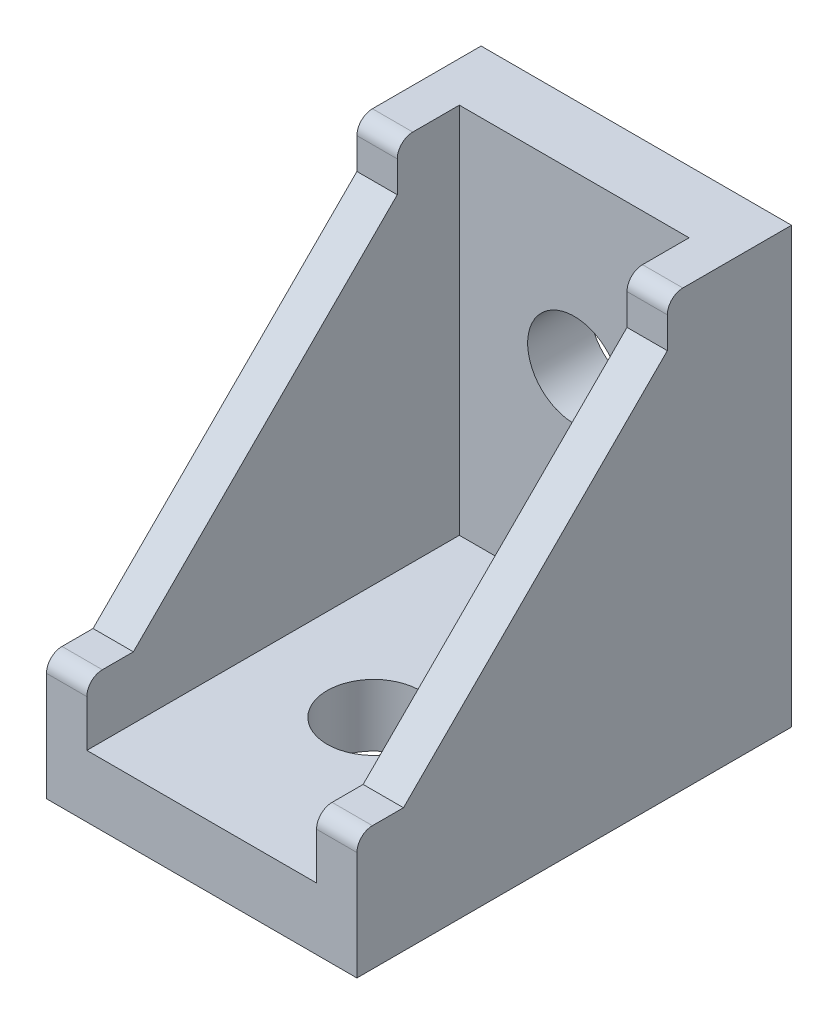
ISO-10303-21;
HEADER;
FILE_DESCRIPTION(('STEP AP214'),'2;1');
FILE_NAME('part.step','',(''),(''),'','','');
FILE_SCHEMA(('AUTOMOTIVE_DESIGN { 1 0 10303 214 1 1 1 1 }'));
ENDSEC;
DATA;
#1=APPLICATION_CONTEXT('core data for automotive mechanical design processes');
#2=APPLICATION_PROTOCOL_DEFINITION('international standard','automotive_design',2000,#1);
#3=PRODUCT_CONTEXT('',#1,'mechanical');
#4=PRODUCT('Part','Part','',(#3));
#5=PRODUCT_RELATED_PRODUCT_CATEGORY('part','',(#4));
#6=PRODUCT_DEFINITION_FORMATION('','',#4);
#7=PRODUCT_DEFINITION_CONTEXT('part definition',#1,'design');
#8=PRODUCT_DEFINITION('design','',#6,#7);
#9=PRODUCT_DEFINITION_SHAPE('','',#8);
#10=(LENGTH_UNIT() NAMED_UNIT(*) SI_UNIT(.MILLI.,.METRE.));
#11=(NAMED_UNIT(*) PLANE_ANGLE_UNIT() SI_UNIT($,.RADIAN.));
#12=(NAMED_UNIT(*) SI_UNIT($,.STERADIAN.) SOLID_ANGLE_UNIT());
#13=UNCERTAINTY_MEASURE_WITH_UNIT(LENGTH_MEASURE(1.E-05),#10,'distance_accuracy_value','');
#14=(GEOMETRIC_REPRESENTATION_CONTEXT(3) GLOBAL_UNCERTAINTY_ASSIGNED_CONTEXT((#13)) GLOBAL_UNIT_ASSIGNED_CONTEXT((#10,
#11,#12)) REPRESENTATION_CONTEXT('',''));
#15=CARTESIAN_POINT('',(0.,0.,0.));
#16=DIRECTION('',(0.,0.,1.));
#17=DIRECTION('',(1.,0.,0.));
#18=AXIS2_PLACEMENT_3D('',#15,#16,#17);
#19=CARTESIAN_POINT('',(-10.,-9.99999999999998,28.));
#20=DIRECTION('',(0.,-1.,0.));
#21=DIRECTION('',(0.,0.,-1.));
#22=AXIS2_PLACEMENT_3D('',#19,#20,#21);
#23=PLANE('',#22);
#24=DIRECTION('',(0.,0.,1.));
#25=VECTOR('',#24,1.);
#26=CARTESIAN_POINT('',(7.40000000000001,-9.99999999999998,4.));
#27=LINE('',#26,#25);
#28=CARTESIAN_POINT('',(7.40000000000001,-9.99999999999998,4.));
#29=VERTEX_POINT('',#28);
#30=CARTESIAN_POINT('',(7.40000000000001,-9.99999999999998,28.));
#31=VERTEX_POINT('',#30);
#32=EDGE_CURVE('E344',#29,#31,#27,.T.);
#33=ORIENTED_EDGE('',*,*,#32,.F.);
#34=DIRECTION('',(-1.,0.,0.));
#35=VECTOR('',#34,1.);
#36=CARTESIAN_POINT('',(-10.,-9.99999999999998,4.));
#37=LINE('',#36,#35);
#38=CARTESIAN_POINT('',(-7.40000000000001,-9.99999999999998,4.));
#39=VERTEX_POINT('',#38);
#40=EDGE_CURVE('E174',#29,#39,#37,.T.);
#41=ORIENTED_EDGE('',*,*,#40,.T.);
#42=DIRECTION('',(0.,0.,1.));
#43=VECTOR('',#42,1.);
#44=CARTESIAN_POINT('',(-7.40000000000001,-9.99999999999998,4.));
#45=LINE('',#44,#43);
#46=CARTESIAN_POINT('',(-7.40000000000001,-9.99999999999998,28.));
#47=VERTEX_POINT('',#46);
#48=EDGE_CURVE('E305',#39,#47,#45,.T.);
#49=ORIENTED_EDGE('',*,*,#48,.T.);
#50=DIRECTION('',(-1.,0.,0.));
#51=VECTOR('',#50,1.);
#52=CARTESIAN_POINT('',(-10.,-9.99999999999998,28.));
#53=LINE('',#52,#51);
#54=EDGE_CURVE('E196',#31,#47,#53,.T.);
#55=ORIENTED_EDGE('',*,*,#54,.F.);
#56=EDGE_LOOP('',(#33,#41,#49,#55));
#57=FACE_BOUND('',#56,.T.);
#58=CARTESIAN_POINT('',(0.,-9.99999999999999,16.9205349575155));
#59=DIRECTION('',(0.,-1.,0.));
#60=DIRECTION('',(1.,0.,0.));
#61=AXIS2_PLACEMENT_3D('',#58,#59,#60);
#62=CIRCLE('',#61,3.);
#63=CARTESIAN_POINT('',(3.,-9.99999999999999,16.9205349575155));
#64=VERTEX_POINT('',#63);
#65=EDGE_CURVE('E513',#64,#64,#62,.T.);
#66=ORIENTED_EDGE('',*,*,#65,.T.);
#67=EDGE_LOOP('',(#66));
#68=FACE_BOUND('',#67,.T.);
#69=ADVANCED_FACE('F31',(#57,#68),#23,.F.);
#70=CARTESIAN_POINT('',(-10.,-14.,4.));
#71=DIRECTION('',(0.,1.,0.));
#72=DIRECTION('',(0.,0.,1.));
#73=AXIS2_PLACEMENT_3D('',#70,#71,#72);
#74=PLANE('',#73);
#75=DIRECTION('',(1.,0.,0.));
#76=VECTOR('',#75,1.);
#77=CARTESIAN_POINT('',(-10.,-14.,0.));
#78=LINE('',#77,#76);
#79=CARTESIAN_POINT('',(-10.,-14.,0.));
#80=VERTEX_POINT('',#79);
#81=CARTESIAN_POINT('',(9.99999999999999,-14.,0.));
#82=VERTEX_POINT('',#81);
#83=EDGE_CURVE('E181',#80,#82,#78,.T.);
#84=ORIENTED_EDGE('',*,*,#83,.T.);
#85=DIRECTION('',(0.,0.,-1.));
#86=VECTOR('',#85,1.);
#87=CARTESIAN_POINT('',(9.99999999999999,-14.,4.));
#88=LINE('',#87,#86);
#89=CARTESIAN_POINT('',(9.99999999999999,-14.,28.));
#90=VERTEX_POINT('',#89);
#91=EDGE_CURVE('E180',#90,#82,#88,.T.);
#92=ORIENTED_EDGE('',*,*,#91,.F.);
#93=DIRECTION('',(1.,0.,0.));
#94=VECTOR('',#93,1.);
#95=CARTESIAN_POINT('',(-10.,-14.,28.));
#96=LINE('',#95,#94);
#97=CARTESIAN_POINT('',(-10.,-14.,28.));
#98=VERTEX_POINT('',#97);
#99=EDGE_CURVE('E289',#98,#90,#96,.T.);
#100=ORIENTED_EDGE('',*,*,#99,.F.);
#101=DIRECTION('',(0.,0.,-1.));
#102=VECTOR('',#101,1.);
#103=CARTESIAN_POINT('',(-10.,-14.,4.));
#104=LINE('',#103,#102);
#105=EDGE_CURVE('E184',#98,#80,#104,.T.);
#106=ORIENTED_EDGE('',*,*,#105,.T.);
#107=EDGE_LOOP('',(#84,#92,#100,#106));
#108=FACE_BOUND('',#107,.T.);
#109=CARTESIAN_POINT('',(0.,-14.,16.9205349575155));
#110=DIRECTION('',(0.,-1.,0.));
#111=DIRECTION('',(1.,0.,0.));
#112=AXIS2_PLACEMENT_3D('',#109,#110,#111);
#113=CIRCLE('',#112,3.);
#114=CARTESIAN_POINT('',(3.,-14.,16.9205349575155));
#115=VERTEX_POINT('',#114);
#116=EDGE_CURVE('E510',#115,#115,#113,.T.);
#117=ORIENTED_EDGE('',*,*,#116,.F.);
#118=EDGE_LOOP('',(#117));
#119=FACE_BOUND('',#118,.T.);
#120=ADVANCED_FACE('F327',(#108,#119),#74,.F.);
#121=CARTESIAN_POINT('',(9.99999999999999,-14.,4.));
#122=DIRECTION('',(0.,0.,1.));
#123=DIRECTION('',(1.,0.,0.));
#124=AXIS2_PLACEMENT_3D('',#121,#122,#123);
#125=PLANE('',#124);
#126=CARTESIAN_POINT('',(0.,2.92053495751556,4.));
#127=DIRECTION('',(0.,0.,1.));
#128=DIRECTION('',(1.,0.,0.));
#129=AXIS2_PLACEMENT_3D('',#126,#127,#128);
#130=CIRCLE('',#129,3.);
#131=CARTESIAN_POINT('',(3.,2.92053495751556,4.));
#132=VERTEX_POINT('',#131);
#133=EDGE_CURVE('E515',#132,#132,#130,.T.);
#134=ORIENTED_EDGE('',*,*,#133,.F.);
#135=EDGE_LOOP('',(#134));
#136=FACE_BOUND('',#135,.T.);
#137=ORIENTED_EDGE('',*,*,#40,.F.);
#138=DIRECTION('',(0.,-1.,0.));
#139=VECTOR('',#138,1.);
#140=CARTESIAN_POINT('',(7.40000000000001,14.,4.));
#141=LINE('',#140,#139);
#142=CARTESIAN_POINT('',(7.40000000000001,14.,4.));
#143=VERTEX_POINT('',#142);
#144=EDGE_CURVE('E159',#143,#29,#141,.T.);
#145=ORIENTED_EDGE('',*,*,#144,.F.);
#146=DIRECTION('',(-1.,0.,0.));
#147=VECTOR('',#146,1.);
#148=CARTESIAN_POINT('',(-10.,14.,4.));
#149=LINE('',#148,#147);
#150=CARTESIAN_POINT('',(-7.40000000000001,14.,4.));
#151=VERTEX_POINT('',#150);
#152=EDGE_CURVE('E172',#143,#151,#149,.T.);
#153=ORIENTED_EDGE('',*,*,#152,.T.);
#154=DIRECTION('',(0.,-1.,0.));
#155=VECTOR('',#154,1.);
#156=CARTESIAN_POINT('',(-7.40000000000001,14.,4.));
#157=LINE('',#156,#155);
#158=EDGE_CURVE('E284',#151,#39,#157,.T.);
#159=ORIENTED_EDGE('',*,*,#158,.T.);
#160=EDGE_LOOP('',(#137,#145,#153,#159));
#161=FACE_BOUND('',#160,.T.);
#162=ADVANCED_FACE('F170',(#136,#161),#125,.T.);
#163=CARTESIAN_POINT('',(9.99999999999999,14.,4.));
#164=DIRECTION('',(-1.,0.,0.));
#165=DIRECTION('',(0.,-1.,0.));
#166=AXIS2_PLACEMENT_3D('',#163,#164,#165);
#167=PLANE('',#166);
#168=DIRECTION('',(0.,0.,-1.));
#169=VECTOR('',#168,1.);
#170=CARTESIAN_POINT('',(10.,-5.99999999999998,25.));
#171=LINE('',#170,#169);
#172=CARTESIAN_POINT('',(10.,-5.99999999999998,27.));
#173=VERTEX_POINT('',#172);
#174=CARTESIAN_POINT('',(10.,-5.99999999999998,25.));
#175=VERTEX_POINT('',#174);
#176=EDGE_CURVE('E175',#173,#175,#171,.T.);
#177=ORIENTED_EDGE('',*,*,#176,.F.);
#178=CARTESIAN_POINT('',(9.99999999999999,-6.99999999999998,27.));
#179=DIRECTION('',(-1.,0.,0.));
#180=DIRECTION('',(0.,-1.,0.));
#181=AXIS2_PLACEMENT_3D('',#178,#179,#180);
#182=CIRCLE('',#181,1.);
#183=CARTESIAN_POINT('',(9.99999999999999,-6.99999999999998,28.));
#184=VERTEX_POINT('',#183);
#185=EDGE_CURVE('E229',#173,#184,#182,.F.);
#186=ORIENTED_EDGE('',*,*,#185,.T.);
#187=DIRECTION('',(0.,1.,0.));
#188=VECTOR('',#187,1.);
#189=CARTESIAN_POINT('',(9.99999999999999,-14.,28.));
#190=LINE('',#189,#188);
#191=EDGE_CURVE('E292',#90,#184,#190,.T.);
#192=ORIENTED_EDGE('',*,*,#191,.F.);
#193=ORIENTED_EDGE('',*,*,#91,.T.);
#194=DIRECTION('',(0.,1.,0.));
#195=VECTOR('',#194,1.);
#196=CARTESIAN_POINT('',(9.99999999999999,14.,0.));
#197=LINE('',#196,#195);
#198=CARTESIAN_POINT('',(9.99999999999999,14.,0.));
#199=VERTEX_POINT('',#198);
#200=EDGE_CURVE('E192',#82,#199,#197,.T.);
#201=ORIENTED_EDGE('',*,*,#200,.T.);
#202=DIRECTION('',(0.,0.,-1.));
#203=VECTOR('',#202,1.);
#204=CARTESIAN_POINT('',(9.99999999999999,14.,4.));
#205=LINE('',#204,#203);
#206=CARTESIAN_POINT('',(9.99999999999999,14.,7.));
#207=VERTEX_POINT('',#206);
#208=EDGE_CURVE('E204',#207,#199,#205,.T.);
#209=ORIENTED_EDGE('',*,*,#208,.F.);
#210=CARTESIAN_POINT('',(9.99999999999999,13.,7.));
#211=DIRECTION('',(-1.,0.,0.));
#212=DIRECTION('',(0.,-1.,0.));
#213=AXIS2_PLACEMENT_3D('',#210,#211,#212);
#214=CIRCLE('',#213,1.);
#215=CARTESIAN_POINT('',(10.,13.,8.));
#216=VERTEX_POINT('',#215);
#217=EDGE_CURVE('E227',#207,#216,#214,.F.);
#218=ORIENTED_EDGE('',*,*,#217,.T.);
#219=DIRECTION('',(0.,1.,0.));
#220=VECTOR('',#219,1.);
#221=CARTESIAN_POINT('',(10.,14.,8.));
#222=LINE('',#221,#220);
#223=CARTESIAN_POINT('',(10.,11.,8.));
#224=VERTEX_POINT('',#223);
#225=EDGE_CURVE('E351',#224,#216,#222,.T.);
#226=ORIENTED_EDGE('',*,*,#225,.F.);
#227=DIRECTION('',(0.,0.707106781186547,-0.707106781186548));
#228=VECTOR('',#227,1.);
#229=CARTESIAN_POINT('',(10.,11.,8.));
#230=LINE('',#229,#228);
#231=EDGE_CURVE('E353',#175,#224,#230,.T.);
#232=ORIENTED_EDGE('',*,*,#231,.F.);
#233=EDGE_LOOP('',(#177,#186,#192,#193,#201,#209,#218,#226,#232));
#234=FACE_BOUND('',#233,.T.);
#235=ADVANCED_FACE('F242',(#234),#167,.F.);
#236=CARTESIAN_POINT('',(-10.,14.,4.));
#237=DIRECTION('',(0.,-1.,0.));
#238=DIRECTION('',(0.,0.,-1.));
#239=AXIS2_PLACEMENT_3D('',#236,#237,#238);
#240=PLANE('',#239);
#241=DIRECTION('',(0.,0.,-1.));
#242=VECTOR('',#241,1.);
#243=CARTESIAN_POINT('',(7.40000000000001,14.,4.));
#244=LINE('',#243,#242);
#245=CARTESIAN_POINT('',(7.40000000000001,14.,7.));
#246=VERTEX_POINT('',#245);
#247=EDGE_CURVE('E154',#246,#143,#244,.T.);
#248=ORIENTED_EDGE('',*,*,#247,.F.);
#249=DIRECTION('',(1.,0.,0.));
#250=VECTOR('',#249,1.);
#251=CARTESIAN_POINT('',(-10.,14.,7.));
#252=LINE('',#251,#250);
#253=EDGE_CURVE('E236',#246,#207,#252,.T.);
#254=ORIENTED_EDGE('',*,*,#253,.T.);
#255=ORIENTED_EDGE('',*,*,#208,.T.);
#256=DIRECTION('',(-1.,0.,0.));
#257=VECTOR('',#256,1.);
#258=CARTESIAN_POINT('',(-10.,14.,0.));
#259=LINE('',#258,#257);
#260=CARTESIAN_POINT('',(-10.,14.,0.));
#261=VERTEX_POINT('',#260);
#262=EDGE_CURVE('E195',#199,#261,#259,.T.);
#263=ORIENTED_EDGE('',*,*,#262,.T.);
#264=DIRECTION('',(0.,0.,-1.));
#265=VECTOR('',#264,1.);
#266=CARTESIAN_POINT('',(-10.,14.,4.));
#267=LINE('',#266,#265);
#268=CARTESIAN_POINT('',(-10.,14.,7.));
#269=VERTEX_POINT('',#268);
#270=EDGE_CURVE('E202',#269,#261,#267,.T.);
#271=ORIENTED_EDGE('',*,*,#270,.F.);
#272=DIRECTION('',(-1.,0.,0.));
#273=VECTOR('',#272,1.);
#274=CARTESIAN_POINT('',(-7.40000000000001,14.,7.));
#275=LINE('',#274,#273);
#276=CARTESIAN_POINT('',(-7.40000000000001,14.,7.));
#277=VERTEX_POINT('',#276);
#278=EDGE_CURVE('E234',#269,#277,#275,.F.);
#279=ORIENTED_EDGE('',*,*,#278,.T.);
#280=DIRECTION('',(0.,0.,-1.));
#281=VECTOR('',#280,1.);
#282=CARTESIAN_POINT('',(-7.40000000000001,14.,4.));
#283=LINE('',#282,#281);
#284=EDGE_CURVE('E179',#277,#151,#283,.T.);
#285=ORIENTED_EDGE('',*,*,#284,.T.);
#286=ORIENTED_EDGE('',*,*,#152,.F.);
#287=EDGE_LOOP('',(#248,#254,#255,#263,#271,#279,#285,#286));
#288=FACE_BOUND('',#287,.T.);
#289=ADVANCED_FACE('F177',(#288),#240,.F.);
#290=CARTESIAN_POINT('',(-10.,14.,4.));
#291=DIRECTION('',(1.,0.,0.));
#292=DIRECTION('',(0.,1.,0.));
#293=AXIS2_PLACEMENT_3D('',#290,#291,#292);
#294=PLANE('',#293);
#295=DIRECTION('',(0.,-1.,0.));
#296=VECTOR('',#295,1.);
#297=CARTESIAN_POINT('',(-10.,-14.,28.));
#298=LINE('',#297,#296);
#299=CARTESIAN_POINT('',(-10.,-6.99999999999998,28.));
#300=VERTEX_POINT('',#299);
#301=EDGE_CURVE('E208',#300,#98,#298,.T.);
#302=ORIENTED_EDGE('',*,*,#301,.F.);
#303=CARTESIAN_POINT('',(-10.,-6.99999999999998,27.));
#304=DIRECTION('',(1.,0.,0.));
#305=DIRECTION('',(0.,1.,0.));
#306=AXIS2_PLACEMENT_3D('',#303,#304,#305);
#307=CIRCLE('',#306,1.);
#308=CARTESIAN_POINT('',(-10.,-5.99999999999998,27.));
#309=VERTEX_POINT('',#308);
#310=EDGE_CURVE('E216',#300,#309,#307,.F.);
#311=ORIENTED_EDGE('',*,*,#310,.T.);
#312=DIRECTION('',(0.,0.,-1.));
#313=VECTOR('',#312,1.);
#314=CARTESIAN_POINT('',(-10.,-5.99999999999998,25.));
#315=LINE('',#314,#313);
#316=CARTESIAN_POINT('',(-10.,-5.99999999999998,25.));
#317=VERTEX_POINT('',#316);
#318=EDGE_CURVE('E276',#309,#317,#315,.T.);
#319=ORIENTED_EDGE('',*,*,#318,.T.);
#320=DIRECTION('',(0.,0.707106781186547,-0.707106781186548));
#321=VECTOR('',#320,1.);
#322=CARTESIAN_POINT('',(-10.,11.,8.));
#323=LINE('',#322,#321);
#324=CARTESIAN_POINT('',(-10.,11.,8.));
#325=VERTEX_POINT('',#324);
#326=EDGE_CURVE('E278',#317,#325,#323,.T.);
#327=ORIENTED_EDGE('',*,*,#326,.T.);
#328=DIRECTION('',(0.,1.,0.));
#329=VECTOR('',#328,1.);
#330=CARTESIAN_POINT('',(-10.,14.,8.));
#331=LINE('',#330,#329);
#332=CARTESIAN_POINT('',(-10.,13.,8.));
#333=VERTEX_POINT('',#332);
#334=EDGE_CURVE('E282',#325,#333,#331,.T.);
#335=ORIENTED_EDGE('',*,*,#334,.T.);
#336=CARTESIAN_POINT('',(-10.,13.,7.));
#337=DIRECTION('',(1.,0.,0.));
#338=DIRECTION('',(0.,1.,0.));
#339=AXIS2_PLACEMENT_3D('',#336,#337,#338);
#340=CIRCLE('',#339,1.);
#341=EDGE_CURVE('E214',#333,#269,#340,.F.);
#342=ORIENTED_EDGE('',*,*,#341,.T.);
#343=ORIENTED_EDGE('',*,*,#270,.T.);
#344=DIRECTION('',(0.,-1.,0.));
#345=VECTOR('',#344,1.);
#346=CARTESIAN_POINT('',(-10.,14.,0.));
#347=LINE('',#346,#345);
#348=EDGE_CURVE('E186',#261,#80,#347,.T.);
#349=ORIENTED_EDGE('',*,*,#348,.T.);
#350=ORIENTED_EDGE('',*,*,#105,.F.);
#351=EDGE_LOOP('',(#302,#311,#319,#327,#335,#342,#343,#349,#350));
#352=FACE_BOUND('',#351,.T.);
#353=ADVANCED_FACE('F321',(#352),#294,.F.);
#354=CARTESIAN_POINT('',(9.99999999999999,-14.,0.));
#355=DIRECTION('',(0.,0.,1.));
#356=DIRECTION('',(1.,0.,0.));
#357=AXIS2_PLACEMENT_3D('',#354,#355,#356);
#358=PLANE('',#357);
#359=CARTESIAN_POINT('',(0.,2.92053495751556,0.));
#360=DIRECTION('',(0.,0.,1.));
#361=DIRECTION('',(1.,0.,0.));
#362=AXIS2_PLACEMENT_3D('',#359,#360,#361);
#363=CIRCLE('',#362,3.);
#364=CARTESIAN_POINT('',(3.,2.92053495751556,0.));
#365=VERTEX_POINT('',#364);
#366=EDGE_CURVE('E354',#365,#365,#363,.T.);
#367=ORIENTED_EDGE('',*,*,#366,.T.);
#368=EDGE_LOOP('',(#367));
#369=FACE_BOUND('',#368,.T.);
#370=ORIENTED_EDGE('',*,*,#200,.F.);
#371=ORIENTED_EDGE('',*,*,#83,.F.);
#372=ORIENTED_EDGE('',*,*,#348,.F.);
#373=ORIENTED_EDGE('',*,*,#262,.F.);
#374=EDGE_LOOP('',(#370,#371,#372,#373));
#375=FACE_BOUND('',#374,.T.);
#376=ADVANCED_FACE('F248',(#369,#375),#358,.F.);
#377=CARTESIAN_POINT('',(-10.,-9.99999999999998,28.));
#378=DIRECTION('',(0.,0.,-1.));
#379=DIRECTION('',(-1.,0.,0.));
#380=AXIS2_PLACEMENT_3D('',#377,#378,#379);
#381=PLANE('',#380);
#382=DIRECTION('',(0.,1.,0.));
#383=VECTOR('',#382,1.);
#384=CARTESIAN_POINT('',(-7.40000000000001,-5.99999999999998,28.));
#385=LINE('',#384,#383);
#386=CARTESIAN_POINT('',(-7.40000000000001,-6.99999999999998,28.));
#387=VERTEX_POINT('',#386);
#388=EDGE_CURVE('E299',#47,#387,#385,.T.);
#389=ORIENTED_EDGE('',*,*,#388,.T.);
#390=DIRECTION('',(-1.,0.,0.));
#391=VECTOR('',#390,1.);
#392=CARTESIAN_POINT('',(-10.,-6.99999999999998,28.));
#393=LINE('',#392,#391);
#394=EDGE_CURVE('E211',#387,#300,#393,.T.);
#395=ORIENTED_EDGE('',*,*,#394,.T.);
#396=ORIENTED_EDGE('',*,*,#301,.T.);
#397=ORIENTED_EDGE('',*,*,#99,.T.);
#398=ORIENTED_EDGE('',*,*,#191,.T.);
#399=DIRECTION('',(1.,0.,0.));
#400=VECTOR('',#399,1.);
#401=CARTESIAN_POINT('',(-10.,-6.99999999999998,28.));
#402=LINE('',#401,#400);
#403=CARTESIAN_POINT('',(7.40000000000001,-6.99999999999998,28.));
#404=VERTEX_POINT('',#403);
#405=EDGE_CURVE('E206',#184,#404,#402,.F.);
#406=ORIENTED_EDGE('',*,*,#405,.T.);
#407=DIRECTION('',(0.,1.,0.));
#408=VECTOR('',#407,1.);
#409=CARTESIAN_POINT('',(7.40000000000001,-5.99999999999998,28.));
#410=LINE('',#409,#408);
#411=EDGE_CURVE('E301',#31,#404,#410,.T.);
#412=ORIENTED_EDGE('',*,*,#411,.F.);
#413=ORIENTED_EDGE('',*,*,#54,.T.);
#414=EDGE_LOOP('',(#389,#395,#396,#397,#398,#406,#412,#413));
#415=FACE_BOUND('',#414,.T.);
#416=ADVANCED_FACE('F298',(#415),#381,.F.);
#417=CARTESIAN_POINT('',(-7.40000000000001,14.,8.));
#418=DIRECTION('',(0.,0.,1.));
#419=DIRECTION('',(1.,0.,0.));
#420=AXIS2_PLACEMENT_3D('',#417,#418,#419);
#421=PLANE('',#420);
#422=DIRECTION('',(0.,1.,0.));
#423=VECTOR('',#422,1.);
#424=CARTESIAN_POINT('',(-7.40000000000001,14.,8.));
#425=LINE('',#424,#423);
#426=CARTESIAN_POINT('',(-7.40000000000001,11.,8.));
#427=VERTEX_POINT('',#426);
#428=CARTESIAN_POINT('',(-7.40000000000001,13.,8.));
#429=VERTEX_POINT('',#428);
#430=EDGE_CURVE('E262',#427,#429,#425,.T.);
#431=ORIENTED_EDGE('',*,*,#430,.T.);
#432=DIRECTION('',(-1.,0.,0.));
#433=VECTOR('',#432,1.);
#434=CARTESIAN_POINT('',(-10.,13.,8.));
#435=LINE('',#434,#433);
#436=EDGE_CURVE('E11',#429,#333,#435,.T.);
#437=ORIENTED_EDGE('',*,*,#436,.T.);
#438=ORIENTED_EDGE('',*,*,#334,.F.);
#439=DIRECTION('',(-1.,0.,0.));
#440=VECTOR('',#439,1.);
#441=CARTESIAN_POINT('',(-7.40000000000001,11.,8.));
#442=LINE('',#441,#440);
#443=EDGE_CURVE('E209',#427,#325,#442,.T.);
#444=ORIENTED_EDGE('',*,*,#443,.F.);
#445=EDGE_LOOP('',(#431,#437,#438,#444));
#446=FACE_BOUND('',#445,.T.);
#447=ADVANCED_FACE('F265',(#446),#421,.T.);
#448=CARTESIAN_POINT('',(-7.40000000000001,11.,8.));
#449=DIRECTION('',(0.,0.707106781186548,0.707106781186547));
#450=DIRECTION('',(0.,-0.707106781186547,0.707106781186548));
#451=AXIS2_PLACEMENT_3D('',#448,#449,#450);
#452=PLANE('',#451);
#453=ORIENTED_EDGE('',*,*,#326,.F.);
#454=DIRECTION('',(-1.,0.,0.));
#455=VECTOR('',#454,1.);
#456=CARTESIAN_POINT('',(-7.40000000000001,-5.99999999999998,25.));
#457=LINE('',#456,#455);
#458=CARTESIAN_POINT('',(-7.40000000000001,-5.99999999999998,25.));
#459=VERTEX_POINT('',#458);
#460=EDGE_CURVE('E270',#459,#317,#457,.T.);
#461=ORIENTED_EDGE('',*,*,#460,.F.);
#462=DIRECTION('',(0.,0.707106781186547,-0.707106781186548));
#463=VECTOR('',#462,1.);
#464=CARTESIAN_POINT('',(-7.40000000000001,11.,8.));
#465=LINE('',#464,#463);
#466=EDGE_CURVE('E268',#459,#427,#465,.T.);
#467=ORIENTED_EDGE('',*,*,#466,.T.);
#468=ORIENTED_EDGE('',*,*,#443,.T.);
#469=EDGE_LOOP('',(#453,#461,#467,#468));
#470=FACE_BOUND('',#469,.T.);
#471=ADVANCED_FACE('F319',(#470),#452,.T.);
#472=CARTESIAN_POINT('',(-7.40000000000001,-5.99999999999998,25.));
#473=DIRECTION('',(0.,1.,0.));
#474=DIRECTION('',(-1.,0.,0.));
#475=AXIS2_PLACEMENT_3D('',#472,#473,#474);
#476=PLANE('',#475);
#477=ORIENTED_EDGE('',*,*,#318,.F.);
#478=DIRECTION('',(-1.,0.,0.));
#479=VECTOR('',#478,1.);
#480=CARTESIAN_POINT('',(-7.40000000000001,-5.99999999999998,27.));
#481=LINE('',#480,#479);
#482=CARTESIAN_POINT('',(-7.40000000000001,-5.99999999999998,27.));
#483=VERTEX_POINT('',#482);
#484=EDGE_CURVE('E218',#309,#483,#481,.F.);
#485=ORIENTED_EDGE('',*,*,#484,.T.);
#486=DIRECTION('',(0.,0.,-1.));
#487=VECTOR('',#486,1.);
#488=CARTESIAN_POINT('',(-7.40000000000001,-5.99999999999998,25.));
#489=LINE('',#488,#487);
#490=EDGE_CURVE('E272',#483,#459,#489,.T.);
#491=ORIENTED_EDGE('',*,*,#490,.T.);
#492=ORIENTED_EDGE('',*,*,#460,.T.);
#493=EDGE_LOOP('',(#477,#485,#491,#492));
#494=FACE_BOUND('',#493,.T.);
#495=ADVANCED_FACE('F315',(#494),#476,.T.);
#496=CARTESIAN_POINT('',(-7.40000000000001,-9.99999999999998,4.));
#497=DIRECTION('',(-1.,0.,0.));
#498=DIRECTION('',(0.,-1.,0.));
#499=AXIS2_PLACEMENT_3D('',#496,#497,#498);
#500=PLANE('',#499);
#501=ORIENTED_EDGE('',*,*,#490,.F.);
#502=CARTESIAN_POINT('',(-7.40000000000001,-6.99999999999998,27.));
#503=DIRECTION('',(-1.,0.,0.));
#504=DIRECTION('',(0.,-1.,0.));
#505=AXIS2_PLACEMENT_3D('',#502,#503,#504);
#506=CIRCLE('',#505,1.);
#507=EDGE_CURVE('E222',#483,#387,#506,.F.);
#508=ORIENTED_EDGE('',*,*,#507,.T.);
#509=ORIENTED_EDGE('',*,*,#388,.F.);
#510=ORIENTED_EDGE('',*,*,#48,.F.);
#511=ORIENTED_EDGE('',*,*,#158,.F.);
#512=ORIENTED_EDGE('',*,*,#284,.F.);
#513=CARTESIAN_POINT('',(-7.40000000000001,13.,7.));
#514=DIRECTION('',(-1.,0.,0.));
#515=DIRECTION('',(0.,-1.,0.));
#516=AXIS2_PLACEMENT_3D('',#513,#514,#515);
#517=CIRCLE('',#516,1.);
#518=EDGE_CURVE('E220',#277,#429,#517,.F.);
#519=ORIENTED_EDGE('',*,*,#518,.T.);
#520=ORIENTED_EDGE('',*,*,#430,.F.);
#521=ORIENTED_EDGE('',*,*,#466,.F.);
#522=EDGE_LOOP('',(#501,#508,#509,#510,#511,#512,#519,#520,#521));
#523=FACE_BOUND('',#522,.T.);
#524=ADVANCED_FACE('F260',(#523),#500,.F.);
#525=CARTESIAN_POINT('',(7.40000000000001,-5.99999999999998,25.));
#526=DIRECTION('',(0.,-1.,0.));
#527=DIRECTION('',(1.,0.,0.));
#528=AXIS2_PLACEMENT_3D('',#525,#526,#527);
#529=PLANE('',#528);
#530=DIRECTION('',(0.,0.,-1.));
#531=VECTOR('',#530,1.);
#532=CARTESIAN_POINT('',(7.40000000000001,-5.99999999999998,25.));
#533=LINE('',#532,#531);
#534=CARTESIAN_POINT('',(7.40000000000001,-5.99999999999998,27.));
#535=VERTEX_POINT('',#534);
#536=CARTESIAN_POINT('',(7.40000000000001,-5.99999999999998,25.));
#537=VERTEX_POINT('',#536);
#538=EDGE_CURVE('E340',#535,#537,#533,.T.);
#539=ORIENTED_EDGE('',*,*,#538,.F.);
#540=DIRECTION('',(1.,0.,0.));
#541=VECTOR('',#540,1.);
#542=CARTESIAN_POINT('',(7.40000000000001,-5.99999999999998,27.));
#543=LINE('',#542,#541);
#544=EDGE_CURVE('E224',#535,#173,#543,.T.);
#545=ORIENTED_EDGE('',*,*,#544,.T.);
#546=ORIENTED_EDGE('',*,*,#176,.T.);
#547=DIRECTION('',(1.,0.,0.));
#548=VECTOR('',#547,1.);
#549=CARTESIAN_POINT('',(7.40000000000001,-5.99999999999998,25.));
#550=LINE('',#549,#548);
#551=EDGE_CURVE('E279',#537,#175,#550,.T.);
#552=ORIENTED_EDGE('',*,*,#551,.F.);
#553=EDGE_LOOP('',(#539,#545,#546,#552));
#554=FACE_BOUND('',#553,.T.);
#555=ADVANCED_FACE('F337',(#554),#529,.F.);
#556=CARTESIAN_POINT('',(7.40000000000001,11.,8.));
#557=DIRECTION('',(0.,-0.707106781186548,-0.707106781186547));
#558=DIRECTION('',(0.,0.707106781186547,-0.707106781186548));
#559=AXIS2_PLACEMENT_3D('',#556,#557,#558);
#560=PLANE('',#559);
#561=ORIENTED_EDGE('',*,*,#231,.T.);
#562=DIRECTION('',(1.,0.,0.));
#563=VECTOR('',#562,1.);
#564=CARTESIAN_POINT('',(7.40000000000001,11.,8.));
#565=LINE('',#564,#563);
#566=CARTESIAN_POINT('',(7.40000000000001,11.,8.));
#567=VERTEX_POINT('',#566);
#568=EDGE_CURVE('E350',#567,#224,#565,.T.);
#569=ORIENTED_EDGE('',*,*,#568,.F.);
#570=DIRECTION('',(0.,0.707106781186547,-0.707106781186548));
#571=VECTOR('',#570,1.);
#572=CARTESIAN_POINT('',(7.40000000000001,11.,8.));
#573=LINE('',#572,#571);
#574=EDGE_CURVE('E342',#537,#567,#573,.T.);
#575=ORIENTED_EDGE('',*,*,#574,.F.);
#576=ORIENTED_EDGE('',*,*,#551,.T.);
#577=EDGE_LOOP('',(#561,#569,#575,#576));
#578=FACE_BOUND('',#577,.T.);
#579=ADVANCED_FACE('F361',(#578),#560,.F.);
#580=CARTESIAN_POINT('',(7.40000000000001,14.,8.));
#581=DIRECTION('',(0.,0.,-1.));
#582=DIRECTION('',(-1.,0.,0.));
#583=AXIS2_PLACEMENT_3D('',#580,#581,#582);
#584=PLANE('',#583);
#585=ORIENTED_EDGE('',*,*,#225,.T.);
#586=DIRECTION('',(1.,0.,0.));
#587=VECTOR('',#586,1.);
#588=CARTESIAN_POINT('',(7.40000000000001,13.,8.));
#589=LINE('',#588,#587);
#590=CARTESIAN_POINT('',(7.40000000000001,13.,8.));
#591=VERTEX_POINT('',#590);
#592=EDGE_CURVE('E39',#216,#591,#589,.F.);
#593=ORIENTED_EDGE('',*,*,#592,.T.);
#594=DIRECTION('',(0.,1.,0.));
#595=VECTOR('',#594,1.);
#596=CARTESIAN_POINT('',(7.40000000000001,14.,8.));
#597=LINE('',#596,#595);
#598=EDGE_CURVE('E165',#567,#591,#597,.T.);
#599=ORIENTED_EDGE('',*,*,#598,.F.);
#600=ORIENTED_EDGE('',*,*,#568,.T.);
#601=EDGE_LOOP('',(#585,#593,#599,#600));
#602=FACE_BOUND('',#601,.T.);
#603=ADVANCED_FACE('F359',(#602),#584,.F.);
#604=CARTESIAN_POINT('',(7.40000000000001,-9.99999999999998,4.));
#605=DIRECTION('',(1.,0.,0.));
#606=DIRECTION('',(0.,-1.,0.));
#607=AXIS2_PLACEMENT_3D('',#604,#605,#606);
#608=PLANE('',#607);
#609=ORIENTED_EDGE('',*,*,#411,.T.);
#610=CARTESIAN_POINT('',(7.40000000000001,-6.99999999999998,27.));
#611=DIRECTION('',(1.,0.,0.));
#612=DIRECTION('',(0.,1.,0.));
#613=AXIS2_PLACEMENT_3D('',#610,#611,#612);
#614=CIRCLE('',#613,1.);
#615=EDGE_CURVE('E232',#404,#535,#614,.F.);
#616=ORIENTED_EDGE('',*,*,#615,.T.);
#617=ORIENTED_EDGE('',*,*,#538,.T.);
#618=ORIENTED_EDGE('',*,*,#574,.T.);
#619=ORIENTED_EDGE('',*,*,#598,.T.);
#620=CARTESIAN_POINT('',(7.40000000000001,13.,7.));
#621=DIRECTION('',(1.,0.,0.));
#622=DIRECTION('',(0.,1.,0.));
#623=AXIS2_PLACEMENT_3D('',#620,#621,#622);
#624=CIRCLE('',#623,1.);
#625=EDGE_CURVE('E46',#591,#246,#624,.F.);
#626=ORIENTED_EDGE('',*,*,#625,.T.);
#627=ORIENTED_EDGE('',*,*,#247,.T.);
#628=ORIENTED_EDGE('',*,*,#144,.T.);
#629=ORIENTED_EDGE('',*,*,#32,.T.);
#630=EDGE_LOOP('',(#609,#616,#617,#618,#619,#626,#627,#628,#629));
#631=FACE_BOUND('',#630,.T.);
#632=ADVANCED_FACE('F157',(#631),#608,.F.);
#633=CARTESIAN_POINT('',(-10.,-6.99999999999998,27.));
#634=DIRECTION('',(1.,0.,0.));
#635=DIRECTION('',(0.,1.,0.));
#636=AXIS2_PLACEMENT_3D('',#633,#634,#635);
#637=CYLINDRICAL_SURFACE('',#636,1.);
#638=ORIENTED_EDGE('',*,*,#507,.F.);
#639=ORIENTED_EDGE('',*,*,#484,.F.);
#640=ORIENTED_EDGE('',*,*,#310,.F.);
#641=ORIENTED_EDGE('',*,*,#394,.F.);
#642=EDGE_LOOP('',(#638,#639,#640,#641));
#643=FACE_BOUND('',#642,.T.);
#644=ADVANCED_FACE('F323',(#643),#637,.T.);
#645=CARTESIAN_POINT('',(7.40000000000001,-6.99999999999998,27.));
#646=DIRECTION('',(1.,0.,0.));
#647=DIRECTION('',(0.,1.,0.));
#648=AXIS2_PLACEMENT_3D('',#645,#646,#647);
#649=CYLINDRICAL_SURFACE('',#648,1.);
#650=ORIENTED_EDGE('',*,*,#615,.F.);
#651=ORIENTED_EDGE('',*,*,#405,.F.);
#652=ORIENTED_EDGE('',*,*,#185,.F.);
#653=ORIENTED_EDGE('',*,*,#544,.F.);
#654=EDGE_LOOP('',(#650,#651,#652,#653));
#655=FACE_BOUND('',#654,.T.);
#656=ADVANCED_FACE('F334',(#655),#649,.T.);
#657=CARTESIAN_POINT('',(-10.,13.,7.));
#658=DIRECTION('',(1.,0.,0.));
#659=DIRECTION('',(0.,0.,-1.));
#660=AXIS2_PLACEMENT_3D('',#657,#658,#659);
#661=CYLINDRICAL_SURFACE('',#660,1.);
#662=ORIENTED_EDGE('',*,*,#625,.F.);
#663=ORIENTED_EDGE('',*,*,#592,.F.);
#664=ORIENTED_EDGE('',*,*,#217,.F.);
#665=ORIENTED_EDGE('',*,*,#253,.F.);
#666=EDGE_LOOP('',(#662,#663,#664,#665));
#667=FACE_BOUND('',#666,.T.);
#668=ADVANCED_FACE('F362',(#667),#661,.T.);
#669=CARTESIAN_POINT('',(-7.40000000000001,13.,7.));
#670=DIRECTION('',(1.,0.,0.));
#671=DIRECTION('',(0.,0.,-1.));
#672=AXIS2_PLACEMENT_3D('',#669,#670,#671);
#673=CYLINDRICAL_SURFACE('',#672,1.);
#674=ORIENTED_EDGE('',*,*,#518,.F.);
#675=ORIENTED_EDGE('',*,*,#278,.F.);
#676=ORIENTED_EDGE('',*,*,#341,.F.);
#677=ORIENTED_EDGE('',*,*,#436,.F.);
#678=EDGE_LOOP('',(#674,#675,#676,#677));
#679=FACE_BOUND('',#678,.T.);
#680=ADVANCED_FACE('F33',(#679),#673,.T.);
#681=CARTESIAN_POINT('',(0.,2.92053495751556,0.));
#682=DIRECTION('',(0.,0.,1.));
#683=DIRECTION('',(1.,0.,0.));
#684=AXIS2_PLACEMENT_3D('',#681,#682,#683);
#685=CYLINDRICAL_SURFACE('',#684,3.);
#686=ORIENTED_EDGE('',*,*,#366,.F.);
#687=EDGE_LOOP('',(#686));
#688=FACE_BOUND('',#687,.T.);
#689=ORIENTED_EDGE('',*,*,#133,.T.);
#690=EDGE_LOOP('',(#689));
#691=FACE_BOUND('',#690,.T.);
#692=ADVANCED_FACE('F368',(#688,#691),#685,.F.);
#693=CARTESIAN_POINT('',(0.,-14.,16.9205349575155));
#694=DIRECTION('',(0.,1.,0.));
#695=DIRECTION('',(0.,0.,1.));
#696=AXIS2_PLACEMENT_3D('',#693,#694,#695);
#697=CYLINDRICAL_SURFACE('',#696,3.);
#698=ORIENTED_EDGE('',*,*,#116,.T.);
#699=EDGE_LOOP('',(#698));
#700=FACE_BOUND('',#699,.T.);
#701=ORIENTED_EDGE('',*,*,#65,.F.);
#702=EDGE_LOOP('',(#701));
#703=FACE_BOUND('',#702,.T.);
#704=ADVANCED_FACE('F483',(#700,#703),#697,.F.);
#705=CLOSED_SHELL('',(#69,#120,#162,#235,#289,#353,#376,#416,#447,#471,#495,#524,#555,#579,#603,
#632,#644,#656,#668,#680,#692,#704));
#706=MANIFOLD_SOLID_BREP('B2',#705);
#707=ADVANCED_BREP_SHAPE_REPRESENTATION('',(#18,#706),#14);
#708=SHAPE_DEFINITION_REPRESENTATION(#9,#707);
ENDSEC;
END-ISO-10303-21;
